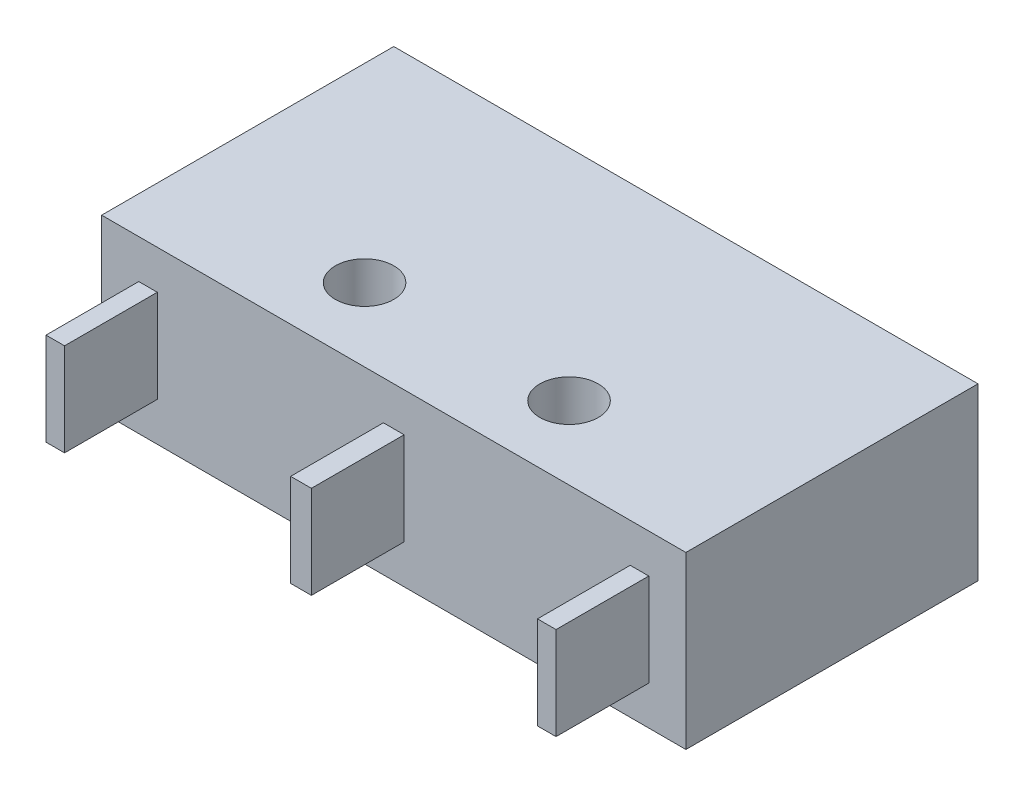
ISO-10303-21;
HEADER;
FILE_DESCRIPTION(('STEP AP214'),'2;1');
FILE_NAME('part.step','',(''),(''),'','','');
FILE_SCHEMA(('AUTOMOTIVE_DESIGN { 1 0 10303 214 1 1 1 1 }'));
ENDSEC;
DATA;
#1=APPLICATION_CONTEXT('core data for automotive mechanical design processes');
#2=APPLICATION_PROTOCOL_DEFINITION('international standard','automotive_design',2000,#1);
#3=PRODUCT_CONTEXT('',#1,'mechanical');
#4=PRODUCT('Part','Part','',(#3));
#5=PRODUCT_RELATED_PRODUCT_CATEGORY('part','',(#4));
#6=PRODUCT_DEFINITION_FORMATION('','',#4);
#7=PRODUCT_DEFINITION_CONTEXT('part definition',#1,'design');
#8=PRODUCT_DEFINITION('design','',#6,#7);
#9=PRODUCT_DEFINITION_SHAPE('','',#8);
#10=(LENGTH_UNIT() NAMED_UNIT(*) SI_UNIT(.MILLI.,.METRE.));
#11=(NAMED_UNIT(*) PLANE_ANGLE_UNIT() SI_UNIT($,.RADIAN.));
#12=(NAMED_UNIT(*) SI_UNIT($,.STERADIAN.) SOLID_ANGLE_UNIT());
#13=UNCERTAINTY_MEASURE_WITH_UNIT(LENGTH_MEASURE(1.E-05),#10,'distance_accuracy_value','');
#14=(GEOMETRIC_REPRESENTATION_CONTEXT(3) GLOBAL_UNCERTAINTY_ASSIGNED_CONTEXT((#13)) GLOBAL_UNIT_ASSIGNED_CONTEXT((#10,
#11,#12)) REPRESENTATION_CONTEXT('',''));
#15=CARTESIAN_POINT('',(0.,0.,0.));
#16=DIRECTION('',(0.,0.,1.));
#17=DIRECTION('',(1.,0.,0.));
#18=AXIS2_PLACEMENT_3D('',#15,#16,#17);
#19=CARTESIAN_POINT('',(-10.,5.842,5.));
#20=DIRECTION('',(0.,0.,-1.));
#21=DIRECTION('',(-1.,0.,0.));
#22=AXIS2_PLACEMENT_3D('',#19,#20,#21);
#23=PLANE('',#22);
#24=DIRECTION('',(1.,0.,0.));
#25=VECTOR('',#24,1.);
#26=CARTESIAN_POINT('',(8.73,1.3335,5.));
#27=LINE('',#26,#25);
#28=CARTESIAN_POINT('',(8.095,1.3335,5.));
#29=VERTEX_POINT('',#28);
#30=CARTESIAN_POINT('',(8.73,1.3335,5.));
#31=VERTEX_POINT('',#30);
#32=EDGE_CURVE('E203',#29,#31,#27,.T.);
#33=ORIENTED_EDGE('',*,*,#32,.F.);
#34=DIRECTION('',(0.,1.,0.));
#35=VECTOR('',#34,1.);
#36=CARTESIAN_POINT('',(8.095,1.3335,5.));
#37=LINE('',#36,#35);
#38=CARTESIAN_POINT('',(8.095,4.5085,5.));
#39=VERTEX_POINT('',#38);
#40=EDGE_CURVE('E198',#29,#39,#37,.T.);
#41=ORIENTED_EDGE('',*,*,#40,.T.);
#42=DIRECTION('',(1.,0.,0.));
#43=VECTOR('',#42,1.);
#44=CARTESIAN_POINT('',(8.73,4.5085,5.));
#45=LINE('',#44,#43);
#46=CARTESIAN_POINT('',(8.73,4.5085,5.));
#47=VERTEX_POINT('',#46);
#48=EDGE_CURVE('E204',#39,#47,#45,.T.);
#49=ORIENTED_EDGE('',*,*,#48,.T.);
#50=DIRECTION('',(0.,1.,0.));
#51=VECTOR('',#50,1.);
#52=CARTESIAN_POINT('',(8.73,1.3335,5.));
#53=LINE('',#52,#51);
#54=EDGE_CURVE('E201',#31,#47,#53,.T.);
#55=ORIENTED_EDGE('',*,*,#54,.F.);
#56=EDGE_LOOP('',(#33,#41,#49,#55));
#57=FACE_BOUND('',#56,.T.);
#58=DIRECTION('',(0.,1.,0.));
#59=VECTOR('',#58,1.);
#60=CARTESIAN_POINT('',(-8.095,1.3335,5.));
#61=LINE('',#60,#59);
#62=CARTESIAN_POINT('',(-8.095,1.3335,5.));
#63=VERTEX_POINT('',#62);
#64=CARTESIAN_POINT('',(-8.095,4.5085,5.));
#65=VERTEX_POINT('',#64);
#66=EDGE_CURVE('E245',#63,#65,#61,.T.);
#67=ORIENTED_EDGE('',*,*,#66,.F.);
#68=DIRECTION('',(1.,0.,0.));
#69=VECTOR('',#68,1.);
#70=CARTESIAN_POINT('',(-8.73,1.3335,5.));
#71=LINE('',#70,#69);
#72=CARTESIAN_POINT('',(-8.73,1.3335,5.));
#73=VERTEX_POINT('',#72);
#74=EDGE_CURVE('E224',#73,#63,#71,.T.);
#75=ORIENTED_EDGE('',*,*,#74,.F.);
#76=DIRECTION('',(0.,1.,0.));
#77=VECTOR('',#76,1.);
#78=CARTESIAN_POINT('',(-8.73,1.3335,5.));
#79=LINE('',#78,#77);
#80=CARTESIAN_POINT('',(-8.73,4.5085,5.));
#81=VERTEX_POINT('',#80);
#82=EDGE_CURVE('E248',#73,#81,#79,.T.);
#83=ORIENTED_EDGE('',*,*,#82,.T.);
#84=DIRECTION('',(1.,0.,0.));
#85=VECTOR('',#84,1.);
#86=CARTESIAN_POINT('',(-8.73,4.5085,5.));
#87=LINE('',#86,#85);
#88=EDGE_CURVE('E235',#81,#65,#87,.T.);
#89=ORIENTED_EDGE('',*,*,#88,.T.);
#90=EDGE_LOOP('',(#67,#75,#83,#89));
#91=FACE_BOUND('',#90,.T.);
#92=DIRECTION('',(1.,0.,0.));
#93=VECTOR('',#92,1.);
#94=CARTESIAN_POINT('',(-10.,0.,5.));
#95=LINE('',#94,#93);
#96=CARTESIAN_POINT('',(-10.,0.,5.));
#97=VERTEX_POINT('',#96);
#98=CARTESIAN_POINT('',(10.,0.,5.));
#99=VERTEX_POINT('',#98);
#100=EDGE_CURVE('E255',#97,#99,#95,.T.);
#101=ORIENTED_EDGE('',*,*,#100,.T.);
#102=DIRECTION('',(0.,-1.,0.));
#103=VECTOR('',#102,1.);
#104=CARTESIAN_POINT('',(10.,5.842,5.));
#105=LINE('',#104,#103);
#106=CARTESIAN_POINT('',(10.,5.842,5.));
#107=VERTEX_POINT('',#106);
#108=EDGE_CURVE('E261',#107,#99,#105,.T.);
#109=ORIENTED_EDGE('',*,*,#108,.F.);
#110=DIRECTION('',(1.,0.,0.));
#111=VECTOR('',#110,1.);
#112=CARTESIAN_POINT('',(-10.,5.842,5.));
#113=LINE('',#112,#111);
#114=CARTESIAN_POINT('',(-10.,5.842,5.));
#115=VERTEX_POINT('',#114);
#116=EDGE_CURVE('E259',#115,#107,#113,.T.);
#117=ORIENTED_EDGE('',*,*,#116,.F.);
#118=DIRECTION('',(0.,-1.,0.));
#119=VECTOR('',#118,1.);
#120=CARTESIAN_POINT('',(-10.,5.842,5.));
#121=LINE('',#120,#119);
#122=EDGE_CURVE('E271',#115,#97,#121,.T.);
#123=ORIENTED_EDGE('',*,*,#122,.T.);
#124=EDGE_LOOP('',(#101,#109,#117,#123));
#125=FACE_BOUND('',#124,.T.);
#126=DIRECTION('',(1.,0.,0.));
#127=VECTOR('',#126,1.);
#128=CARTESIAN_POINT('',(0.354858535306872,1.3335,5.));
#129=LINE('',#128,#127);
#130=CARTESIAN_POINT('',(-0.354858535306872,1.3335,5.));
#131=VERTEX_POINT('',#130);
#132=CARTESIAN_POINT('',(0.354858535306872,1.3335,5.));
#133=VERTEX_POINT('',#132);
#134=EDGE_CURVE('E175',#131,#133,#129,.T.);
#135=ORIENTED_EDGE('',*,*,#134,.F.);
#136=DIRECTION('',(0.,1.,0.));
#137=VECTOR('',#136,1.);
#138=CARTESIAN_POINT('',(-0.354858535306872,1.3335,5.));
#139=LINE('',#138,#137);
#140=CARTESIAN_POINT('',(-0.354858535306872,4.5085,5.));
#141=VERTEX_POINT('',#140);
#142=EDGE_CURVE('E162',#131,#141,#139,.T.);
#143=ORIENTED_EDGE('',*,*,#142,.T.);
#144=DIRECTION('',(1.,0.,0.));
#145=VECTOR('',#144,1.);
#146=CARTESIAN_POINT('',(0.354858535306872,4.5085,5.));
#147=LINE('',#146,#145);
#148=CARTESIAN_POINT('',(0.354858535306871,4.5085,5.));
#149=VERTEX_POINT('',#148);
#150=EDGE_CURVE('E167',#141,#149,#147,.T.);
#151=ORIENTED_EDGE('',*,*,#150,.T.);
#152=DIRECTION('',(0.,1.,0.));
#153=VECTOR('',#152,1.);
#154=CARTESIAN_POINT('',(0.354858535306872,1.3335,5.));
#155=LINE('',#154,#153);
#156=EDGE_CURVE('E176',#133,#149,#155,.T.);
#157=ORIENTED_EDGE('',*,*,#156,.F.);
#158=EDGE_LOOP('',(#135,#143,#151,#157));
#159=FACE_BOUND('',#158,.T.);
#160=ADVANCED_FACE('F42',(#57,#91,#125,#159),#23,.F.);
#161=CARTESIAN_POINT('',(10.,5.842,-5.));
#162=DIRECTION('',(-1.,0.,0.));
#163=DIRECTION('',(0.,0.,1.));
#164=AXIS2_PLACEMENT_3D('',#161,#162,#163);
#165=PLANE('',#164);
#166=DIRECTION('',(0.,0.,-1.));
#167=VECTOR('',#166,1.);
#168=CARTESIAN_POINT('',(10.,0.,-5.));
#169=LINE('',#168,#167);
#170=CARTESIAN_POINT('',(10.,0.,-5.));
#171=VERTEX_POINT('',#170);
#172=EDGE_CURVE('E250',#99,#171,#169,.T.);
#173=ORIENTED_EDGE('',*,*,#172,.T.);
#174=DIRECTION('',(0.,-1.,0.));
#175=VECTOR('',#174,1.);
#176=CARTESIAN_POINT('',(10.,5.842,-5.));
#177=LINE('',#176,#175);
#178=CARTESIAN_POINT('',(10.,5.842,-5.));
#179=VERTEX_POINT('',#178);
#180=EDGE_CURVE('E11',#179,#171,#177,.T.);
#181=ORIENTED_EDGE('',*,*,#180,.F.);
#182=DIRECTION('',(0.,0.,-1.));
#183=VECTOR('',#182,1.);
#184=CARTESIAN_POINT('',(10.,5.842,-5.));
#185=LINE('',#184,#183);
#186=EDGE_CURVE('E251',#107,#179,#185,.T.);
#187=ORIENTED_EDGE('',*,*,#186,.F.);
#188=ORIENTED_EDGE('',*,*,#108,.T.);
#189=EDGE_LOOP('',(#173,#181,#187,#188));
#190=FACE_BOUND('',#189,.T.);
#191=ADVANCED_FACE('F44',(#190),#165,.F.);
#192=CARTESIAN_POINT('',(-10.,5.842,-5.));
#193=DIRECTION('',(0.,0.,1.));
#194=DIRECTION('',(1.,0.,0.));
#195=AXIS2_PLACEMENT_3D('',#192,#193,#194);
#196=PLANE('',#195);
#197=DIRECTION('',(-1.,0.,0.));
#198=VECTOR('',#197,1.);
#199=CARTESIAN_POINT('',(-10.,0.,-5.));
#200=LINE('',#199,#198);
#201=CARTESIAN_POINT('',(-10.,0.,-5.));
#202=VERTEX_POINT('',#201);
#203=EDGE_CURVE('E264',#171,#202,#200,.T.);
#204=ORIENTED_EDGE('',*,*,#203,.T.);
#205=DIRECTION('',(0.,-1.,0.));
#206=VECTOR('',#205,1.);
#207=CARTESIAN_POINT('',(-10.,5.842,-5.));
#208=LINE('',#207,#206);
#209=CARTESIAN_POINT('',(-10.,5.842,-5.));
#210=VERTEX_POINT('',#209);
#211=EDGE_CURVE('E50',#210,#202,#208,.T.);
#212=ORIENTED_EDGE('',*,*,#211,.F.);
#213=DIRECTION('',(-1.,0.,0.));
#214=VECTOR('',#213,1.);
#215=CARTESIAN_POINT('',(-10.,5.842,-5.));
#216=LINE('',#215,#214);
#217=EDGE_CURVE('E254',#179,#210,#216,.T.);
#218=ORIENTED_EDGE('',*,*,#217,.F.);
#219=ORIENTED_EDGE('',*,*,#180,.T.);
#220=EDGE_LOOP('',(#204,#212,#218,#219));
#221=FACE_BOUND('',#220,.T.);
#222=ADVANCED_FACE('F293',(#221),#196,.F.);
#223=CARTESIAN_POINT('',(-10.,5.842,-5.));
#224=DIRECTION('',(1.,0.,0.));
#225=DIRECTION('',(0.,0.,-1.));
#226=AXIS2_PLACEMENT_3D('',#223,#224,#225);
#227=PLANE('',#226);
#228=DIRECTION('',(0.,0.,1.));
#229=VECTOR('',#228,1.);
#230=CARTESIAN_POINT('',(-10.,0.,-5.));
#231=LINE('',#230,#229);
#232=EDGE_CURVE('E266',#202,#97,#231,.T.);
#233=ORIENTED_EDGE('',*,*,#232,.T.);
#234=ORIENTED_EDGE('',*,*,#122,.F.);
#235=DIRECTION('',(0.,0.,1.));
#236=VECTOR('',#235,1.);
#237=CARTESIAN_POINT('',(-10.,5.842,-5.));
#238=LINE('',#237,#236);
#239=EDGE_CURVE('E257',#210,#115,#238,.T.);
#240=ORIENTED_EDGE('',*,*,#239,.F.);
#241=ORIENTED_EDGE('',*,*,#211,.T.);
#242=EDGE_LOOP('',(#233,#234,#240,#241));
#243=FACE_BOUND('',#242,.T.);
#244=ADVANCED_FACE('F278',(#243),#227,.F.);
#245=CARTESIAN_POINT('',(0.,5.842,0.));
#246=DIRECTION('',(0.,1.,0.));
#247=DIRECTION('',(0.,0.,1.));
#248=AXIS2_PLACEMENT_3D('',#245,#246,#247);
#249=PLANE('',#248);
#250=CARTESIAN_POINT('',(3.5,5.842,2.5));
#251=DIRECTION('',(0.,-1.,0.));
#252=DIRECTION('',(0.,0.,-1.));
#253=AXIS2_PLACEMENT_3D('',#250,#251,#252);
#254=CIRCLE('',#253,1.);
#255=CARTESIAN_POINT('',(3.5,5.842,1.5));
#256=VERTEX_POINT('',#255);
#257=EDGE_CURVE('E381',#256,#256,#254,.T.);
#258=ORIENTED_EDGE('',*,*,#257,.T.);
#259=EDGE_LOOP('',(#258));
#260=FACE_BOUND('',#259,.T.);
#261=CARTESIAN_POINT('',(-3.5,5.842,2.5));
#262=DIRECTION('',(0.,-1.,0.));
#263=DIRECTION('',(0.,0.,1.));
#264=AXIS2_PLACEMENT_3D('',#261,#262,#263);
#265=CIRCLE('',#264,1.);
#266=CARTESIAN_POINT('',(-3.5,5.842,3.5));
#267=VERTEX_POINT('',#266);
#268=EDGE_CURVE('E389',#267,#267,#265,.T.);
#269=ORIENTED_EDGE('',*,*,#268,.T.);
#270=EDGE_LOOP('',(#269));
#271=FACE_BOUND('',#270,.T.);
#272=ORIENTED_EDGE('',*,*,#186,.T.);
#273=ORIENTED_EDGE('',*,*,#217,.T.);
#274=ORIENTED_EDGE('',*,*,#239,.T.);
#275=ORIENTED_EDGE('',*,*,#116,.T.);
#276=EDGE_LOOP('',(#272,#273,#274,#275));
#277=FACE_BOUND('',#276,.T.);
#278=ADVANCED_FACE('F292',(#260,#271,#277),#249,.T.);
#279=CARTESIAN_POINT('',(0.,0.,0.));
#280=DIRECTION('',(0.,1.,0.));
#281=DIRECTION('',(0.,0.,1.));
#282=AXIS2_PLACEMENT_3D('',#279,#280,#281);
#283=PLANE('',#282);
#284=CARTESIAN_POINT('',(3.5,0.,2.5));
#285=DIRECTION('',(0.,-1.,0.));
#286=DIRECTION('',(0.,0.,-1.));
#287=AXIS2_PLACEMENT_3D('',#284,#285,#286);
#288=CIRCLE('',#287,1.);
#289=CARTESIAN_POINT('',(3.5,0.,1.5));
#290=VERTEX_POINT('',#289);
#291=EDGE_CURVE('E384',#290,#290,#288,.T.);
#292=ORIENTED_EDGE('',*,*,#291,.F.);
#293=EDGE_LOOP('',(#292));
#294=FACE_BOUND('',#293,.T.);
#295=CARTESIAN_POINT('',(-3.5,0.,2.5));
#296=DIRECTION('',(0.,-1.,0.));
#297=DIRECTION('',(0.,0.,1.));
#298=AXIS2_PLACEMENT_3D('',#295,#296,#297);
#299=CIRCLE('',#298,1.);
#300=CARTESIAN_POINT('',(-3.5,0.,3.5));
#301=VERTEX_POINT('',#300);
#302=EDGE_CURVE('E385',#301,#301,#299,.T.);
#303=ORIENTED_EDGE('',*,*,#302,.F.);
#304=EDGE_LOOP('',(#303));
#305=FACE_BOUND('',#304,.T.);
#306=ORIENTED_EDGE('',*,*,#172,.F.);
#307=ORIENTED_EDGE('',*,*,#100,.F.);
#308=ORIENTED_EDGE('',*,*,#232,.F.);
#309=ORIENTED_EDGE('',*,*,#203,.F.);
#310=EDGE_LOOP('',(#306,#307,#308,#309));
#311=FACE_BOUND('',#310,.T.);
#312=ADVANCED_FACE('F284',(#294,#305,#311),#283,.F.);
#313=CARTESIAN_POINT('',(-8.73,1.3335,5.));
#314=DIRECTION('',(1.,0.,0.));
#315=DIRECTION('',(0.,0.,-1.));
#316=AXIS2_PLACEMENT_3D('',#313,#314,#315);
#317=PLANE('',#316);
#318=DIRECTION('',(0.,0.,-1.));
#319=VECTOR('',#318,1.);
#320=CARTESIAN_POINT('',(-8.73,4.5085,5.));
#321=LINE('',#320,#319);
#322=CARTESIAN_POINT('',(-8.73,4.5085,8.175));
#323=VERTEX_POINT('',#322);
#324=EDGE_CURVE('E213',#323,#81,#321,.T.);
#325=ORIENTED_EDGE('',*,*,#324,.T.);
#326=ORIENTED_EDGE('',*,*,#82,.F.);
#327=DIRECTION('',(0.,0.,-1.));
#328=VECTOR('',#327,1.);
#329=CARTESIAN_POINT('',(-8.73,1.3335,5.));
#330=LINE('',#329,#328);
#331=CARTESIAN_POINT('',(-8.73,1.3335,8.175));
#332=VERTEX_POINT('',#331);
#333=EDGE_CURVE('E221',#332,#73,#330,.T.);
#334=ORIENTED_EDGE('',*,*,#333,.F.);
#335=DIRECTION('',(0.,1.,0.));
#336=VECTOR('',#335,1.);
#337=CARTESIAN_POINT('',(-8.73,1.3335,8.175));
#338=LINE('',#337,#336);
#339=EDGE_CURVE('E232',#332,#323,#338,.T.);
#340=ORIENTED_EDGE('',*,*,#339,.T.);
#341=EDGE_LOOP('',(#325,#326,#334,#340));
#342=FACE_BOUND('',#341,.T.);
#343=ADVANCED_FACE('F310',(#342),#317,.F.);
#344=CARTESIAN_POINT('',(-8.095,1.3335,5.));
#345=DIRECTION('',(-1.,0.,0.));
#346=DIRECTION('',(0.,0.,1.));
#347=AXIS2_PLACEMENT_3D('',#344,#345,#346);
#348=PLANE('',#347);
#349=DIRECTION('',(0.,0.,1.));
#350=VECTOR('',#349,1.);
#351=CARTESIAN_POINT('',(-8.095,4.5085,5.));
#352=LINE('',#351,#350);
#353=CARTESIAN_POINT('',(-8.095,4.5085,8.175));
#354=VERTEX_POINT('',#353);
#355=EDGE_CURVE('E237',#65,#354,#352,.T.);
#356=ORIENTED_EDGE('',*,*,#355,.T.);
#357=DIRECTION('',(0.,1.,0.));
#358=VECTOR('',#357,1.);
#359=CARTESIAN_POINT('',(-8.095,1.3335,8.175));
#360=LINE('',#359,#358);
#361=CARTESIAN_POINT('',(-8.095,1.3335,8.175));
#362=VERTEX_POINT('',#361);
#363=EDGE_CURVE('E242',#362,#354,#360,.T.);
#364=ORIENTED_EDGE('',*,*,#363,.F.);
#365=DIRECTION('',(0.,0.,1.));
#366=VECTOR('',#365,1.);
#367=CARTESIAN_POINT('',(-8.095,1.3335,5.));
#368=LINE('',#367,#366);
#369=EDGE_CURVE('E228',#63,#362,#368,.T.);
#370=ORIENTED_EDGE('',*,*,#369,.F.);
#371=ORIENTED_EDGE('',*,*,#66,.T.);
#372=EDGE_LOOP('',(#356,#364,#370,#371));
#373=FACE_BOUND('',#372,.T.);
#374=ADVANCED_FACE('F317',(#373),#348,.F.);
#375=CARTESIAN_POINT('',(-8.095,1.3335,8.175));
#376=DIRECTION('',(0.,0.,-1.));
#377=DIRECTION('',(-1.,0.,0.));
#378=AXIS2_PLACEMENT_3D('',#375,#376,#377);
#379=PLANE('',#378);
#380=DIRECTION('',(-1.,0.,0.));
#381=VECTOR('',#380,1.);
#382=CARTESIAN_POINT('',(-8.095,4.5085,8.175));
#383=LINE('',#382,#381);
#384=EDGE_CURVE('E225',#354,#323,#383,.T.);
#385=ORIENTED_EDGE('',*,*,#384,.T.);
#386=ORIENTED_EDGE('',*,*,#339,.F.);
#387=DIRECTION('',(-1.,0.,0.));
#388=VECTOR('',#387,1.);
#389=CARTESIAN_POINT('',(-8.095,1.3335,8.175));
#390=LINE('',#389,#388);
#391=EDGE_CURVE('E230',#362,#332,#390,.T.);
#392=ORIENTED_EDGE('',*,*,#391,.F.);
#393=ORIENTED_EDGE('',*,*,#363,.T.);
#394=EDGE_LOOP('',(#385,#386,#392,#393));
#395=FACE_BOUND('',#394,.T.);
#396=ADVANCED_FACE('F321',(#395),#379,.F.);
#397=CARTESIAN_POINT('',(0.,1.3335,0.));
#398=DIRECTION('',(0.,-1.,0.));
#399=DIRECTION('',(0.,0.,-1.));
#400=AXIS2_PLACEMENT_3D('',#397,#398,#399);
#401=PLANE('',#400);
#402=ORIENTED_EDGE('',*,*,#333,.T.);
#403=ORIENTED_EDGE('',*,*,#74,.T.);
#404=ORIENTED_EDGE('',*,*,#369,.T.);
#405=ORIENTED_EDGE('',*,*,#391,.T.);
#406=EDGE_LOOP('',(#402,#403,#404,#405));
#407=FACE_BOUND('',#406,.T.);
#408=ADVANCED_FACE('F325',(#407),#401,.T.);
#409=CARTESIAN_POINT('',(0.,4.5085,0.));
#410=DIRECTION('',(0.,-1.,0.));
#411=DIRECTION('',(0.,0.,-1.));
#412=AXIS2_PLACEMENT_3D('',#409,#410,#411);
#413=PLANE('',#412);
#414=ORIENTED_EDGE('',*,*,#324,.F.);
#415=ORIENTED_EDGE('',*,*,#384,.F.);
#416=ORIENTED_EDGE('',*,*,#355,.F.);
#417=ORIENTED_EDGE('',*,*,#88,.F.);
#418=EDGE_LOOP('',(#414,#415,#416,#417));
#419=FACE_BOUND('',#418,.T.);
#420=ADVANCED_FACE('F327',(#419),#413,.F.);
#421=CARTESIAN_POINT('',(8.73,1.3335,5.));
#422=DIRECTION('',(-1.,0.,0.));
#423=DIRECTION('',(0.,0.,1.));
#424=AXIS2_PLACEMENT_3D('',#421,#422,#423);
#425=PLANE('',#424);
#426=DIRECTION('',(0.,0.,1.));
#427=VECTOR('',#426,1.);
#428=CARTESIAN_POINT('',(8.73,4.5085,5.));
#429=LINE('',#428,#427);
#430=CARTESIAN_POINT('',(8.73,4.5085,8.175));
#431=VERTEX_POINT('',#430);
#432=EDGE_CURVE('E65',#47,#431,#429,.T.);
#433=ORIENTED_EDGE('',*,*,#432,.T.);
#434=DIRECTION('',(0.,1.,0.));
#435=VECTOR('',#434,1.);
#436=CARTESIAN_POINT('',(8.73,1.3335,8.175));
#437=LINE('',#436,#435);
#438=CARTESIAN_POINT('',(8.73,1.3335,8.175));
#439=VERTEX_POINT('',#438);
#440=EDGE_CURVE('E185',#439,#431,#437,.T.);
#441=ORIENTED_EDGE('',*,*,#440,.F.);
#442=DIRECTION('',(0.,0.,1.));
#443=VECTOR('',#442,1.);
#444=CARTESIAN_POINT('',(8.73,1.3335,5.));
#445=LINE('',#444,#443);
#446=EDGE_CURVE('E208',#31,#439,#445,.T.);
#447=ORIENTED_EDGE('',*,*,#446,.F.);
#448=ORIENTED_EDGE('',*,*,#54,.T.);
#449=EDGE_LOOP('',(#433,#441,#447,#448));
#450=FACE_BOUND('',#449,.T.);
#451=ADVANCED_FACE('F330',(#450),#425,.F.);
#452=CARTESIAN_POINT('',(8.095,1.3335,8.175));
#453=DIRECTION('',(0.,0.,-1.));
#454=DIRECTION('',(-1.,0.,0.));
#455=AXIS2_PLACEMENT_3D('',#452,#453,#454);
#456=PLANE('',#455);
#457=DIRECTION('',(-1.,0.,0.));
#458=VECTOR('',#457,1.);
#459=CARTESIAN_POINT('',(8.095,4.5085,8.175));
#460=LINE('',#459,#458);
#461=CARTESIAN_POINT('',(8.095,4.5085,8.175));
#462=VERTEX_POINT('',#461);
#463=EDGE_CURVE('E210',#431,#462,#460,.T.);
#464=ORIENTED_EDGE('',*,*,#463,.T.);
#465=DIRECTION('',(0.,1.,0.));
#466=VECTOR('',#465,1.);
#467=CARTESIAN_POINT('',(8.095,1.3335,8.175));
#468=LINE('',#467,#466);
#469=CARTESIAN_POINT('',(8.095,1.3335,8.175));
#470=VERTEX_POINT('',#469);
#471=EDGE_CURVE('E195',#470,#462,#468,.T.);
#472=ORIENTED_EDGE('',*,*,#471,.F.);
#473=DIRECTION('',(-1.,0.,0.));
#474=VECTOR('',#473,1.);
#475=CARTESIAN_POINT('',(8.095,1.3335,8.175));
#476=LINE('',#475,#474);
#477=EDGE_CURVE('E217',#439,#470,#476,.T.);
#478=ORIENTED_EDGE('',*,*,#477,.F.);
#479=ORIENTED_EDGE('',*,*,#440,.T.);
#480=EDGE_LOOP('',(#464,#472,#478,#479));
#481=FACE_BOUND('',#480,.T.);
#482=ADVANCED_FACE('F346',(#481),#456,.F.);
#483=CARTESIAN_POINT('',(8.095,1.3335,5.));
#484=DIRECTION('',(1.,0.,0.));
#485=DIRECTION('',(0.,0.,-1.));
#486=AXIS2_PLACEMENT_3D('',#483,#484,#485);
#487=PLANE('',#486);
#488=DIRECTION('',(0.,0.,-1.));
#489=VECTOR('',#488,1.);
#490=CARTESIAN_POINT('',(8.095,4.5085,5.));
#491=LINE('',#490,#489);
#492=EDGE_CURVE('E207',#462,#39,#491,.T.);
#493=ORIENTED_EDGE('',*,*,#492,.T.);
#494=ORIENTED_EDGE('',*,*,#40,.F.);
#495=DIRECTION('',(0.,0.,-1.));
#496=VECTOR('',#495,1.);
#497=CARTESIAN_POINT('',(8.095,1.3335,5.));
#498=LINE('',#497,#496);
#499=EDGE_CURVE('E215',#470,#29,#498,.T.);
#500=ORIENTED_EDGE('',*,*,#499,.F.);
#501=ORIENTED_EDGE('',*,*,#471,.T.);
#502=EDGE_LOOP('',(#493,#494,#500,#501));
#503=FACE_BOUND('',#502,.T.);
#504=ADVANCED_FACE('F339',(#503),#487,.F.);
#505=CARTESIAN_POINT('',(0.,1.3335,0.));
#506=DIRECTION('',(0.,1.,0.));
#507=DIRECTION('',(0.,0.,1.));
#508=AXIS2_PLACEMENT_3D('',#505,#506,#507);
#509=PLANE('',#508);
#510=ORIENTED_EDGE('',*,*,#446,.T.);
#511=ORIENTED_EDGE('',*,*,#477,.T.);
#512=ORIENTED_EDGE('',*,*,#499,.T.);
#513=ORIENTED_EDGE('',*,*,#32,.T.);
#514=EDGE_LOOP('',(#510,#511,#512,#513));
#515=FACE_BOUND('',#514,.T.);
#516=ADVANCED_FACE('F335',(#515),#509,.F.);
#517=CARTESIAN_POINT('',(0.,4.5085,0.));
#518=DIRECTION('',(0.,1.,0.));
#519=DIRECTION('',(0.,0.,1.));
#520=AXIS2_PLACEMENT_3D('',#517,#518,#519);
#521=PLANE('',#520);
#522=ORIENTED_EDGE('',*,*,#432,.F.);
#523=ORIENTED_EDGE('',*,*,#48,.F.);
#524=ORIENTED_EDGE('',*,*,#492,.F.);
#525=ORIENTED_EDGE('',*,*,#463,.F.);
#526=EDGE_LOOP('',(#522,#523,#524,#525));
#527=FACE_BOUND('',#526,.T.);
#528=ADVANCED_FACE('F338',(#527),#521,.T.);
#529=CARTESIAN_POINT('',(0.354858535306872,1.3335,5.));
#530=DIRECTION('',(-1.,0.,0.));
#531=DIRECTION('',(0.,0.,1.));
#532=AXIS2_PLACEMENT_3D('',#529,#530,#531);
#533=PLANE('',#532);
#534=DIRECTION('',(0.,0.,1.));
#535=VECTOR('',#534,1.);
#536=CARTESIAN_POINT('',(0.354858535306872,4.5085,5.));
#537=LINE('',#536,#535);
#538=CARTESIAN_POINT('',(0.354858535306872,4.5085,8.175));
#539=VERTEX_POINT('',#538);
#540=EDGE_CURVE('E57',#149,#539,#537,.T.);
#541=ORIENTED_EDGE('',*,*,#540,.T.);
#542=DIRECTION('',(0.,1.,0.));
#543=VECTOR('',#542,1.);
#544=CARTESIAN_POINT('',(0.354858535306872,1.3335,8.175));
#545=LINE('',#544,#543);
#546=CARTESIAN_POINT('',(0.354858535306872,1.3335,8.175));
#547=VERTEX_POINT('',#546);
#548=EDGE_CURVE('E179',#547,#539,#545,.T.);
#549=ORIENTED_EDGE('',*,*,#548,.F.);
#550=DIRECTION('',(0.,0.,1.));
#551=VECTOR('',#550,1.);
#552=CARTESIAN_POINT('',(0.354858535306872,1.3335,5.));
#553=LINE('',#552,#551);
#554=EDGE_CURVE('E173',#133,#547,#553,.T.);
#555=ORIENTED_EDGE('',*,*,#554,.F.);
#556=ORIENTED_EDGE('',*,*,#156,.T.);
#557=EDGE_LOOP('',(#541,#549,#555,#556));
#558=FACE_BOUND('',#557,.T.);
#559=ADVANCED_FACE('F343',(#558),#533,.F.);
#560=CARTESIAN_POINT('',(-0.354858535306872,1.3335,8.175));
#561=DIRECTION('',(0.,0.,-1.));
#562=DIRECTION('',(-1.,0.,0.));
#563=AXIS2_PLACEMENT_3D('',#560,#561,#562);
#564=PLANE('',#563);
#565=DIRECTION('',(-1.,0.,0.));
#566=VECTOR('',#565,1.);
#567=CARTESIAN_POINT('',(-0.354858535306872,4.5085,8.175));
#568=LINE('',#567,#566);
#569=CARTESIAN_POINT('',(-0.354858535306872,4.5085,8.175));
#570=VERTEX_POINT('',#569);
#571=EDGE_CURVE('E166',#539,#570,#568,.T.);
#572=ORIENTED_EDGE('',*,*,#571,.T.);
#573=DIRECTION('',(0.,1.,0.));
#574=VECTOR('',#573,1.);
#575=CARTESIAN_POINT('',(-0.354858535306872,1.3335,8.175));
#576=LINE('',#575,#574);
#577=CARTESIAN_POINT('',(-0.354858535306872,1.3335,8.175));
#578=VERTEX_POINT('',#577);
#579=EDGE_CURVE('E165',#578,#570,#576,.T.);
#580=ORIENTED_EDGE('',*,*,#579,.F.);
#581=DIRECTION('',(-1.,0.,0.));
#582=VECTOR('',#581,1.);
#583=CARTESIAN_POINT('',(-0.354858535306872,1.3335,8.175));
#584=LINE('',#583,#582);
#585=EDGE_CURVE('E189',#547,#578,#584,.T.);
#586=ORIENTED_EDGE('',*,*,#585,.F.);
#587=ORIENTED_EDGE('',*,*,#548,.T.);
#588=EDGE_LOOP('',(#572,#580,#586,#587));
#589=FACE_BOUND('',#588,.T.);
#590=ADVANCED_FACE('F363',(#589),#564,.F.);
#591=CARTESIAN_POINT('',(-0.354858535306872,1.3335,5.));
#592=DIRECTION('',(1.,0.,0.));
#593=DIRECTION('',(0.,0.,-1.));
#594=AXIS2_PLACEMENT_3D('',#591,#592,#593);
#595=PLANE('',#594);
#596=DIRECTION('',(0.,0.,-1.));
#597=VECTOR('',#596,1.);
#598=CARTESIAN_POINT('',(-0.354858535306872,4.5085,5.));
#599=LINE('',#598,#597);
#600=EDGE_CURVE('E158',#570,#141,#599,.T.);
#601=ORIENTED_EDGE('',*,*,#600,.T.);
#602=ORIENTED_EDGE('',*,*,#142,.F.);
#603=DIRECTION('',(0.,0.,-1.));
#604=VECTOR('',#603,1.);
#605=CARTESIAN_POINT('',(-0.354858535306872,1.3335,5.));
#606=LINE('',#605,#604);
#607=EDGE_CURVE('E187',#578,#131,#606,.T.);
#608=ORIENTED_EDGE('',*,*,#607,.F.);
#609=ORIENTED_EDGE('',*,*,#579,.T.);
#610=EDGE_LOOP('',(#601,#602,#608,#609));
#611=FACE_BOUND('',#610,.T.);
#612=ADVANCED_FACE('F159',(#611),#595,.F.);
#613=CARTESIAN_POINT('',(0.,1.3335,0.));
#614=DIRECTION('',(0.,1.,0.));
#615=DIRECTION('',(0.,0.,1.));
#616=AXIS2_PLACEMENT_3D('',#613,#614,#615);
#617=PLANE('',#616);
#618=ORIENTED_EDGE('',*,*,#554,.T.);
#619=ORIENTED_EDGE('',*,*,#585,.T.);
#620=ORIENTED_EDGE('',*,*,#607,.T.);
#621=ORIENTED_EDGE('',*,*,#134,.T.);
#622=EDGE_LOOP('',(#618,#619,#620,#621));
#623=FACE_BOUND('',#622,.T.);
#624=ADVANCED_FACE('F354',(#623),#617,.F.);
#625=CARTESIAN_POINT('',(0.,4.5085,0.));
#626=DIRECTION('',(0.,1.,0.));
#627=DIRECTION('',(0.,0.,1.));
#628=AXIS2_PLACEMENT_3D('',#625,#626,#627);
#629=PLANE('',#628);
#630=ORIENTED_EDGE('',*,*,#540,.F.);
#631=ORIENTED_EDGE('',*,*,#150,.F.);
#632=ORIENTED_EDGE('',*,*,#600,.F.);
#633=ORIENTED_EDGE('',*,*,#571,.F.);
#634=EDGE_LOOP('',(#630,#631,#632,#633));
#635=FACE_BOUND('',#634,.T.);
#636=ADVANCED_FACE('F170',(#635),#629,.T.);
#637=CARTESIAN_POINT('',(-3.5,5.842,2.5));
#638=DIRECTION('',(0.,-1.,0.));
#639=DIRECTION('',(0.,0.,-1.));
#640=AXIS2_PLACEMENT_3D('',#637,#638,#639);
#641=CYLINDRICAL_SURFACE('',#640,1.);
#642=ORIENTED_EDGE('',*,*,#268,.F.);
#643=EDGE_LOOP('',(#642));
#644=FACE_BOUND('',#643,.T.);
#645=ORIENTED_EDGE('',*,*,#302,.T.);
#646=EDGE_LOOP('',(#645));
#647=FACE_BOUND('',#646,.T.);
#648=ADVANCED_FACE('F360',(#644,#647),#641,.F.);
#649=CARTESIAN_POINT('',(3.5,5.842,2.5));
#650=DIRECTION('',(0.,-1.,0.));
#651=DIRECTION('',(0.,0.,-1.));
#652=AXIS2_PLACEMENT_3D('',#649,#650,#651);
#653=CYLINDRICAL_SURFACE('',#652,1.);
#654=ORIENTED_EDGE('',*,*,#257,.F.);
#655=EDGE_LOOP('',(#654));
#656=FACE_BOUND('',#655,.T.);
#657=ORIENTED_EDGE('',*,*,#291,.T.);
#658=EDGE_LOOP('',(#657));
#659=FACE_BOUND('',#658,.T.);
#660=ADVANCED_FACE('F372',(#656,#659),#653,.F.);
#661=CLOSED_SHELL('',(#160,#191,#222,#244,#278,#312,#343,#374,#396,#408,#420,#451,#482,#504,
#516,#528,#559,#590,#612,#624,#636,#648,#660));
#662=MANIFOLD_SOLID_BREP('B2',#661);
#663=ADVANCED_BREP_SHAPE_REPRESENTATION('',(#18,#662),#14);
#664=SHAPE_DEFINITION_REPRESENTATION(#9,#663);
ENDSEC;
END-ISO-10303-21;
